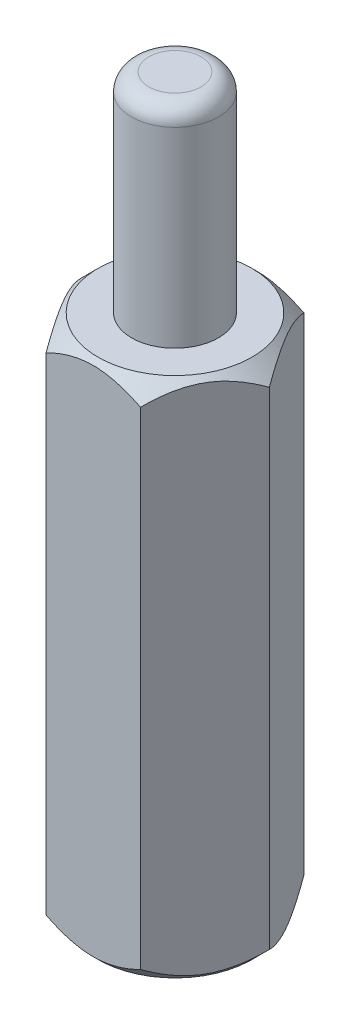
ISO-10303-21;
HEADER;
FILE_DESCRIPTION(('STEP AP214'),'2;1');
FILE_NAME('part.step','',(''),(''),'','','');
FILE_SCHEMA(('AUTOMOTIVE_DESIGN { 1 0 10303 214 1 1 1 1 }'));
ENDSEC;
DATA;
#1=APPLICATION_CONTEXT('core data for automotive mechanical design processes');
#2=APPLICATION_PROTOCOL_DEFINITION('international standard','automotive_design',2000,#1);
#3=PRODUCT_CONTEXT('',#1,'mechanical');
#4=PRODUCT('Part','Part','',(#3));
#5=PRODUCT_RELATED_PRODUCT_CATEGORY('part','',(#4));
#6=PRODUCT_DEFINITION_FORMATION('','',#4);
#7=PRODUCT_DEFINITION_CONTEXT('part definition',#1,'design');
#8=PRODUCT_DEFINITION('design','',#6,#7);
#9=PRODUCT_DEFINITION_SHAPE('','',#8);
#10=(LENGTH_UNIT() NAMED_UNIT(*) SI_UNIT(.MILLI.,.METRE.));
#11=(NAMED_UNIT(*) PLANE_ANGLE_UNIT() SI_UNIT($,.RADIAN.));
#12=(NAMED_UNIT(*) SI_UNIT($,.STERADIAN.) SOLID_ANGLE_UNIT());
#13=UNCERTAINTY_MEASURE_WITH_UNIT(LENGTH_MEASURE(1.E-05),#10,'distance_accuracy_value','');
#14=(GEOMETRIC_REPRESENTATION_CONTEXT(3) GLOBAL_UNCERTAINTY_ASSIGNED_CONTEXT((#13)) GLOBAL_UNIT_ASSIGNED_CONTEXT((#10,
#11,#12)) REPRESENTATION_CONTEXT('',''));
#15=CARTESIAN_POINT('',(0.,0.,0.));
#16=DIRECTION('',(0.,0.,1.));
#17=DIRECTION('',(1.,0.,0.));
#18=AXIS2_PLACEMENT_3D('',#15,#16,#17);
#19=CARTESIAN_POINT('',(0.,21.,0.));
#20=DIRECTION('',(0.,-1.,0.));
#21=DIRECTION('',(0.,0.,-1.));
#22=AXIS2_PLACEMENT_3D('',#19,#20,#21);
#23=CYLINDRICAL_SURFACE('',#22,1.25);
#24=CARTESIAN_POINT('',(0.,20.5,0.));
#25=DIRECTION('',(0.,1.,0.));
#26=DIRECTION('',(0.,0.,1.));
#27=AXIS2_PLACEMENT_3D('',#24,#25,#26);
#28=CIRCLE('',#27,1.25);
#29=CARTESIAN_POINT('',(0.,20.5,1.25));
#30=VERTEX_POINT('',#29);
#31=EDGE_CURVE('E11',#30,#30,#28,.F.);
#32=ORIENTED_EDGE('',*,*,#31,.T.);
#33=EDGE_LOOP('',(#32));
#34=FACE_BOUND('',#33,.T.);
#35=CARTESIAN_POINT('',(0.,15.,0.));
#36=DIRECTION('',(0.,1.,0.));
#37=DIRECTION('',(0.,0.,1.));
#38=AXIS2_PLACEMENT_3D('',#35,#36,#37);
#39=CIRCLE('',#38,1.25);
#40=CARTESIAN_POINT('',(0.,15.,1.25));
#41=VERTEX_POINT('',#40);
#42=EDGE_CURVE('E57',#41,#41,#39,.T.);
#43=ORIENTED_EDGE('',*,*,#42,.T.);
#44=EDGE_LOOP('',(#43));
#45=FACE_BOUND('',#44,.T.);
#46=ADVANCED_FACE('F46',(#34,#45),#23,.T.);
#47=CARTESIAN_POINT('',(0.,21.,0.));
#48=DIRECTION('',(0.,1.,0.));
#49=DIRECTION('',(0.,0.,1.));
#50=AXIS2_PLACEMENT_3D('',#47,#48,#49);
#51=PLANE('',#50);
#52=CARTESIAN_POINT('',(0.,21.,0.));
#53=DIRECTION('',(0.,1.,0.));
#54=DIRECTION('',(0.,0.,1.));
#55=AXIS2_PLACEMENT_3D('',#52,#53,#54);
#56=CIRCLE('',#55,0.75);
#57=CARTESIAN_POINT('',(0.,21.,0.75));
#58=VERTEX_POINT('',#57);
#59=EDGE_CURVE('E53',#58,#58,#56,.T.);
#60=ORIENTED_EDGE('',*,*,#59,.T.);
#61=EDGE_LOOP('',(#60));
#62=FACE_BOUND('',#61,.T.);
#63=ADVANCED_FACE('F67',(#62),#51,.T.);
#64=CARTESIAN_POINT('',(0.,15.,0.));
#65=DIRECTION('',(0.,1.,0.));
#66=DIRECTION('',(0.,0.,1.));
#67=AXIS2_PLACEMENT_3D('',#64,#65,#66);
#68=PLANE('',#67);
#69=ORIENTED_EDGE('',*,*,#42,.F.);
#70=EDGE_LOOP('',(#69));
#71=FACE_BOUND('',#70,.T.);
#72=ADVANCED_FACE('F65',(#71),#68,.F.);
#73=CARTESIAN_POINT('',(0.,20.5,0.));
#74=DIRECTION('',(0.,1.,0.));
#75=DIRECTION('',(0.,0.,1.));
#76=AXIS2_PLACEMENT_3D('',#73,#74,#75);
#77=TOROIDAL_SURFACE('',#76,0.75,0.5);
#78=ORIENTED_EDGE('',*,*,#31,.F.);
#79=EDGE_LOOP('',(#78));
#80=FACE_BOUND('',#79,.T.);
#81=ORIENTED_EDGE('',*,*,#59,.F.);
#82=EDGE_LOOP('',(#81));
#83=FACE_BOUND('',#82,.T.);
#84=ADVANCED_FACE('F48',(#80,#83),#77,.T.);
#85=CLOSED_SHELL('',(#46,#63,#72,#84));
#86=MANIFOLD_SOLID_BREP('B2',#85);
#87=CARTESIAN_POINT('',(1.35677313259565,15.,2.34999999999999));
#88=DIRECTION('',(-0.866025403784441,0.,-0.499999999999995));
#89=DIRECTION('',(-0.499999999999995,0.,0.866025403784441));
#90=AXIS2_PLACEMENT_3D('',#87,#88,#89);
#91=PLANE('',#90);
#92=CARTESIAN_POINT('',(2.71366173524508,0.500115477423954,-0.0002));
#93=CARTESIAN_POINT('',(2.66702181897453,0.45351442075486,0.0805827046413603));
#94=CARTESIAN_POINT('',(2.619602011949,0.409650231593763,0.162716219694685));
#95=CARTESIAN_POINT('',(2.5229077509184,0.329335803551845,0.33019559260002));
#96=CARTESIAN_POINT('',(2.47362410019065,0.292930253802988,0.415557379642964));
#97=CARTESIAN_POINT('',(2.37424596072594,0.230566757708878,0.5876853663575));
#98=CARTESIAN_POINT('',(2.3241767832868,0.204452056148391,0.674407725575282));
#99=CARTESIAN_POINT('',(2.22293612155872,0.164216868168014,0.84976169548021));
#100=CARTESIAN_POINT('',(2.17176773038475,0.150066345438941,0.938387948735085));
#101=CARTESIAN_POINT('',(2.08358239463315,0.137298959127493,1.09112943073937));
#102=CARTESIAN_POINT('',(2.04667938843036,0.13540889555121,1.15504731243464));
#103=CARTESIAN_POINT('',(1.97293369217404,0.138592545290332,1.28277860519013));
#104=CARTESIAN_POINT('',(1.93609102779937,0.143668700006084,1.34659197177326));
#105=CARTESIAN_POINT('',(1.86275357290835,0.160495922051712,1.47361616974231));
#106=CARTESIAN_POINT('',(1.82625921808281,0.172254456697005,1.53682624648959));
#107=CARTESIAN_POINT('',(1.75390158173959,0.201800980357546,1.66215334895163));
#108=CARTESIAN_POINT('',(1.71803825206632,0.219588507163032,1.72427045807434));
#109=CARTESIAN_POINT('',(1.62617552865636,0.272395503913702,1.88338136234204));
#110=CARTESIAN_POINT('',(1.57074576121927,0.311395733846912,1.97938853579481));
#111=CARTESIAN_POINT('',(1.48924118578274,0.377233579565033,2.12055860150021));
#112=CARTESIAN_POINT('',(1.46238179358799,0.400365987274775,2.16708043344193));
#113=CARTESIAN_POINT('',(1.40916054946841,0.44873951612495,2.25926233229908));
#114=CARTESIAN_POINT('',(1.38279840408548,0.47397934255917,2.30492290749882));
#115=CARTESIAN_POINT('',(1.35665766254181,0.500115477423954,2.35019999999999));
#116=B_SPLINE_CURVE_WITH_KNOTS('',3,(#92,#93,#94,#95,#96,#97,#98,#99,#100,#101,#102,#103,#104,
#105,#106,#107,#108,#109,#110,#111,#112,#113,#114,#115),.UNSPECIFIED.,.F.,.F.,(4,2,2,2,2,2,2,2,
2,2,2,4),(0.,0.313034643638936,0.627893288091257,0.937751034486846,1.24682854729337,
1.46800568908581,1.68926036503641,1.91076277253884,2.13224820250606,2.4840684999269,
2.65950165672958,2.83482781708433),.UNSPECIFIED.);
#117=CARTESIAN_POINT('',(2.71354626519124,0.5,0.));
#118=VERTEX_POINT('',#117);
#119=CARTESIAN_POINT('',(1.35677313259565,0.5,2.34999999999999));
#120=VERTEX_POINT('',#119);
#121=EDGE_CURVE('E116',#118,#120,#116,.T.);
#122=ORIENTED_EDGE('',*,*,#121,.F.);
#123=DIRECTION('',(0.,-1.,0.));
#124=VECTOR('',#123,1.);
#125=CARTESIAN_POINT('',(2.71354626519124,15.,0.));
#126=LINE('',#125,#124);
#127=CARTESIAN_POINT('',(2.71354626519124,14.5,0.));
#128=VERTEX_POINT('',#127);
#129=EDGE_CURVE('E44',#128,#118,#126,.T.);
#130=ORIENTED_EDGE('',*,*,#129,.F.);
#131=CARTESIAN_POINT('',(1.35665766254181,14.499884522576,2.35019999999999));
#132=CARTESIAN_POINT('',(1.40329757881237,14.5464855792451,2.26941729535863));
#133=CARTESIAN_POINT('',(1.45071738583789,14.5903497684062,2.1872837803053));
#134=CARTESIAN_POINT('',(1.5474116468685,14.6706641964482,2.01980440739997));
#135=CARTESIAN_POINT('',(1.59669529759625,14.707069746197,1.93444262035702));
#136=CARTESIAN_POINT('',(1.69607343706095,14.7694332422911,1.76231463364249));
#137=CARTESIAN_POINT('',(1.7461426145001,14.7955479438516,1.6755922744247));
#138=CARTESIAN_POINT('',(1.84738327622817,14.835783131832,1.50023830451978));
#139=CARTESIAN_POINT('',(1.89855166740214,14.8499336545611,1.4116120512649));
#140=CARTESIAN_POINT('',(1.98673700315374,14.8627010408725,1.25887056926061));
#141=CARTESIAN_POINT('',(2.02364000935653,14.8645911044488,1.19495268756535));
#142=CARTESIAN_POINT('',(2.09738570561285,14.8614074547097,1.06722139480986));
#143=CARTESIAN_POINT('',(2.13422836998752,14.8563312999939,1.00340802822673));
#144=CARTESIAN_POINT('',(2.20756582487855,14.8395040779483,0.876383830257676));
#145=CARTESIAN_POINT('',(2.24406017970408,14.827745543303,0.8131737535104));
#146=CARTESIAN_POINT('',(2.3164178160473,14.7981990196425,0.687846651048354));
#147=CARTESIAN_POINT('',(2.35228114572057,14.780411492837,0.625729541925647));
#148=CARTESIAN_POINT('',(2.44414386913054,14.7276044960863,0.466618637657944));
#149=CARTESIAN_POINT('',(2.49957363656762,14.6886042661531,0.370611464205181));
#150=CARTESIAN_POINT('',(2.58107821200415,14.622766420435,0.229441398499779));
#151=CARTESIAN_POINT('',(2.6079376041989,14.5996340127252,0.182919566558057));
#152=CARTESIAN_POINT('',(2.66115884831848,14.551260483875,0.0907376677009106));
#153=CARTESIAN_POINT('',(2.68752099370141,14.5260206574408,0.0450770925011708));
#154=CARTESIAN_POINT('',(2.71366173524508,14.499884522576,-0.000199999999999792));
#155=B_SPLINE_CURVE_WITH_KNOTS('',3,(#131,#132,#133,#134,#135,#136,#137,#138,#139,#140,#141,
#142,#143,#144,#145,#146,#147,#148,#149,#150,#151,#152,#153,#154),.UNSPECIFIED.,.F.,.F.,(4,2,2,
2,2,2,2,2,2,2,2,4),(0.,0.313034643638936,0.627893288091257,0.937751034486846,1.24682854729337,
1.46800568908581,1.68926036503641,1.91076277253884,2.13224820250606,2.4840684999269,
2.65950165672958,2.83482781708433),.UNSPECIFIED.);
#156=CARTESIAN_POINT('',(1.35677313259565,14.5,2.34999999999999));
#157=VERTEX_POINT('',#156);
#158=EDGE_CURVE('E188',#157,#128,#155,.T.);
#159=ORIENTED_EDGE('',*,*,#158,.F.);
#160=DIRECTION('',(0.,-1.,0.));
#161=VECTOR('',#160,1.);
#162=CARTESIAN_POINT('',(1.35677313259565,15.,2.34999999999999));
#163=LINE('',#162,#161);
#164=EDGE_CURVE('E181',#157,#120,#163,.T.);
#165=ORIENTED_EDGE('',*,*,#164,.T.);
#166=EDGE_LOOP('',(#122,#130,#159,#165));
#167=FACE_BOUND('',#166,.T.);
#168=ADVANCED_FACE('F101',(#167),#91,.F.);
#169=CARTESIAN_POINT('',(2.71354626519124,15.,0.));
#170=DIRECTION('',(-0.866025403784438,0.,0.500000000000001));
#171=DIRECTION('',(0.500000000000001,0.,0.866025403784438));
#172=AXIS2_PLACEMENT_3D('',#169,#170,#171);
#173=PLANE('',#172);
#174=CARTESIAN_POINT('',(1.35665766254178,0.500115477423953,-2.3502));
#175=CARTESIAN_POINT('',(1.40329757881233,0.453514420754859,-2.26941729535864));
#176=CARTESIAN_POINT('',(1.45071738583786,0.40965023159376,-2.18728378030532));
#177=CARTESIAN_POINT('',(1.54741164686847,0.329335803551841,-2.01980440739998));
#178=CARTESIAN_POINT('',(1.59669529759622,0.292930253802983,-1.93444262035704));
#179=CARTESIAN_POINT('',(1.69607343706092,0.230566757708871,-1.7623146336425));
#180=CARTESIAN_POINT('',(1.74614261450007,0.204452056148384,-1.67559227442472));
#181=CARTESIAN_POINT('',(1.84738327622815,0.164216868168006,-1.50023830451979));
#182=CARTESIAN_POINT('',(1.89855166740212,0.150066345438932,-1.41161205126491));
#183=CARTESIAN_POINT('',(1.98673700315372,0.137298959127484,-1.25887056926063));
#184=CARTESIAN_POINT('',(2.02364000935651,0.1354088955512,-1.19495268756536));
#185=CARTESIAN_POINT('',(2.09738570561283,0.138592545290322,-1.06722139480987));
#186=CARTESIAN_POINT('',(2.1342283699875,0.143668700006073,-1.00340802822674));
#187=CARTESIAN_POINT('',(2.20756582487853,0.160495922051701,-0.876383830257693));
#188=CARTESIAN_POINT('',(2.24406017970406,0.172254456696994,-0.813173753510418));
#189=CARTESIAN_POINT('',(2.31641781604728,0.201800980357535,-0.687846651048372));
#190=CARTESIAN_POINT('',(2.35228114572056,0.219588507163021,-0.625729541925665));
#191=CARTESIAN_POINT('',(2.44414386913052,0.272395503913691,-0.466618637657959));
#192=CARTESIAN_POINT('',(2.49957363656761,0.311395733846903,-0.370611464205192));
#193=CARTESIAN_POINT('',(2.58107821200415,0.377233579565027,-0.229441398499787));
#194=CARTESIAN_POINT('',(2.6079376041989,0.400365987274771,-0.182919566558063));
#195=CARTESIAN_POINT('',(2.66115884831848,0.448739516124948,-0.0907376677009135));
#196=CARTESIAN_POINT('',(2.68752099370141,0.473979342559168,-0.0450770925011722));
#197=CARTESIAN_POINT('',(2.71366173524508,0.500115477423954,0.000199999999999914));
#198=B_SPLINE_CURVE_WITH_KNOTS('',3,(#174,#175,#176,#177,#178,#179,#180,#181,#182,#183,#184,
#185,#186,#187,#188,#189,#190,#191,#192,#193,#194,#195,#196,#197),.UNSPECIFIED.,.F.,.F.,(4,2,2,
2,2,2,2,2,2,2,2,4),(0.,0.31303464363894,0.627893288091265,0.937751034486857,1.24682854729338,
1.46800568908582,1.68926036503642,1.91076277253885,2.13224820250607,2.48406849992692,
2.65950165672961,2.83482781708436),.UNSPECIFIED.);
#199=CARTESIAN_POINT('',(1.35677313259562,0.5,-2.35));
#200=VERTEX_POINT('',#199);
#201=EDGE_CURVE('E155',#200,#118,#198,.T.);
#202=ORIENTED_EDGE('',*,*,#201,.F.);
#203=DIRECTION('',(0.,-1.,0.));
#204=VECTOR('',#203,1.);
#205=CARTESIAN_POINT('',(1.35677313259562,15.,-2.35));
#206=LINE('',#205,#204);
#207=CARTESIAN_POINT('',(1.35677313259562,14.5,-2.35));
#208=VERTEX_POINT('',#207);
#209=EDGE_CURVE('E109',#208,#200,#206,.T.);
#210=ORIENTED_EDGE('',*,*,#209,.F.);
#211=CARTESIAN_POINT('',(2.71366173524508,14.499884522576,0.0002));
#212=CARTESIAN_POINT('',(2.66702181897452,14.5464855792451,-0.0805827046413609));
#213=CARTESIAN_POINT('',(2.619602011949,14.5903497684062,-0.162716219694686));
#214=CARTESIAN_POINT('',(2.52290775091839,14.6706641964482,-0.330195592600023));
#215=CARTESIAN_POINT('',(2.47362410019064,14.707069746197,-0.415557379642967));
#216=CARTESIAN_POINT('',(2.37424596072593,14.7694332422911,-0.587685366357504));
#217=CARTESIAN_POINT('',(2.32417678328679,14.7955479438516,-0.674407725575286));
#218=CARTESIAN_POINT('',(2.22293612155871,14.835783131832,-0.849761695480216));
#219=CARTESIAN_POINT('',(2.17176773038473,14.8499336545611,-0.938387948735092));
#220=CARTESIAN_POINT('',(2.08358239463314,14.8627010408725,-1.09112943073938));
#221=CARTESIAN_POINT('',(2.04667938843035,14.8645911044488,-1.15504731243464));
#222=CARTESIAN_POINT('',(1.97293369217402,14.8614074547097,-1.28277860519013));
#223=CARTESIAN_POINT('',(1.93609102779936,14.8563312999939,-1.34659197177326));
#224=CARTESIAN_POINT('',(1.86275357290833,14.8395040779483,-1.47361616974231));
#225=CARTESIAN_POINT('',(1.82625921808279,14.827745543303,-1.53682624648959));
#226=CARTESIAN_POINT('',(1.75390158173958,14.7981990196425,-1.66215334895164));
#227=CARTESIAN_POINT('',(1.7180382520663,14.780411492837,-1.72427045807434));
#228=CARTESIAN_POINT('',(1.62617552865633,14.7276044960863,-1.88338136234205));
#229=CARTESIAN_POINT('',(1.57074576121924,14.6886042661531,-1.97938853579481));
#230=CARTESIAN_POINT('',(1.48924118578271,14.622766420435,-2.12055860150022));
#231=CARTESIAN_POINT('',(1.46238179358796,14.5996340127252,-2.16708043344194));
#232=CARTESIAN_POINT('',(1.40916054946838,14.5512604838751,-2.25926233229909));
#233=CARTESIAN_POINT('',(1.38279840408545,14.5260206574408,-2.30492290749883));
#234=CARTESIAN_POINT('',(1.35665766254178,14.499884522576,-2.3502));
#235=B_SPLINE_CURVE_WITH_KNOTS('',3,(#211,#212,#213,#214,#215,#216,#217,#218,#219,#220,#221,
#222,#223,#224,#225,#226,#227,#228,#229,#230,#231,#232,#233,#234),.UNSPECIFIED.,.F.,.F.,(4,2,2,
2,2,2,2,2,2,2,2,4),(0.,0.31303464363894,0.627893288091266,0.937751034486858,1.24682854729339,
1.46800568908582,1.68926036503642,1.91076277253886,2.13224820250607,2.48406849992693,
2.65950165672961,2.83482781708436),.UNSPECIFIED.);
#236=EDGE_CURVE('E197',#128,#208,#235,.T.);
#237=ORIENTED_EDGE('',*,*,#236,.F.);
#238=ORIENTED_EDGE('',*,*,#129,.T.);
#239=EDGE_LOOP('',(#202,#210,#237,#238));
#240=FACE_BOUND('',#239,.T.);
#241=ADVANCED_FACE('F165',(#240),#173,.F.);
#242=CARTESIAN_POINT('',(1.35677313259562,15.,-2.35));
#243=DIRECTION('',(0.,0.,1.));
#244=DIRECTION('',(1.,0.,0.));
#245=AXIS2_PLACEMENT_3D('',#242,#243,#244);
#246=PLANE('',#245);
#247=CARTESIAN_POINT('',(-4.11620007747229,2.5262430843245,-2.34999999999999));
#248=CARTESIAN_POINT('',(-3.99456062407984,2.4206482959392,-2.34999999999999));
#249=CARTESIAN_POINT('',(-3.87238420139626,2.31565939195619,-2.34999999999999));
#250=CARTESIAN_POINT('',(-3.62654046205172,2.10732553559251,-2.34999999999999));
#251=CARTESIAN_POINT('',(-3.50287246949324,2.00398138180499,-2.34999999999999));
#252=CARTESIAN_POINT('',(-3.25092428246666,1.79715607348113,-2.34999999999999));
#253=CARTESIAN_POINT('',(-3.1226030423497,1.69372472451252,-2.34999999999999));
#254=CARTESIAN_POINT('',(-2.86355572230193,1.48997092714896,-2.34999999999999));
#255=CARTESIAN_POINT('',(-2.73283025157604,1.38964770802441,-2.34999999999999));
#256=CARTESIAN_POINT('',(-2.46800641513511,1.1931600446047,-2.34999999999999));
#257=CARTESIAN_POINT('',(-2.3339038896,1.09700117040959,-2.34999999999999));
#258=CARTESIAN_POINT('',(-2.0613032743926,0.910799147560652,-2.34999999999999));
#259=CARTESIAN_POINT('',(-1.92280172588298,0.820760995346968,-2.34999999999999));
#260=CARTESIAN_POINT('',(-1.64117355798615,0.650614047542826,-2.34999999999999));
#261=CARTESIAN_POINT('',(-1.49808943768717,0.570435820386812,-2.34999999999999));
#262=CARTESIAN_POINT('',(-1.20485643379896,0.424271739306382,-2.35));
#263=CARTESIAN_POINT('',(-1.05472107043102,0.35825997581425,-2.35));
#264=CARTESIAN_POINT('',(-0.821865462112486,0.274942485534353,-2.35));
#265=CARTESIAN_POINT('',(-0.742036508278311,0.249595685883113,-2.35));
#266=CARTESIAN_POINT('',(-0.580476501018406,0.205835788601103,-2.35));
#267=CARTESIAN_POINT('',(-0.498745753007967,0.187421585691351,-2.35));
#268=CARTESIAN_POINT('',(-0.334372246307214,0.15875365473776,-2.35));
#269=CARTESIAN_POINT('',(-0.251738546335381,0.148448964635506,-2.35));
#270=CARTESIAN_POINT('',(-0.0858407417653292,0.136566289649942,-2.35));
#271=CARTESIAN_POINT('',(-0.00257670926849857,0.134987321327513,-2.35));
#272=CARTESIAN_POINT('',(0.163777303536675,0.140683761884499,-2.35));
#273=CARTESIAN_POINT('',(0.246866776487838,0.147973655828653,-2.35));
#274=CARTESIAN_POINT('',(0.411882632160691,0.170874266382379,-2.35));
#275=CARTESIAN_POINT('',(0.493808778405906,0.186486650583509,-2.35));
#276=CARTESIAN_POINT('',(0.656483138387225,0.225136666290385,-2.35));
#277=CARTESIAN_POINT('',(0.737218600446381,0.24822702200939,-2.35));
#278=CARTESIAN_POINT('',(0.89663513591736,0.300570119750988,-2.35));
#279=CARTESIAN_POINT('',(0.975316175413214,0.329822963436416,-2.35));
#280=CARTESIAN_POINT('',(1.14744588710944,0.40020384861402,-2.35));
#281=CARTESIAN_POINT('',(1.24039977634964,0.44253155797546,-2.35));
#282=CARTESIAN_POINT('',(1.42354442733167,0.5328381943151,-2.35));
#283=CARTESIAN_POINT('',(1.51373356413394,0.580820367305655,-2.35));
#284=CARTESIAN_POINT('',(1.69185571070467,0.681182160709709,-2.35000000000001));
#285=CARTESIAN_POINT('',(1.77978369059033,0.733570635503712,-2.35000000000001));
#286=CARTESIAN_POINT('',(1.95354761418705,0.841649940673027,-2.35000000000001));
#287=CARTESIAN_POINT('',(2.03938396636662,0.897340118855266,-2.35000000000001));
#288=CARTESIAN_POINT('',(2.20977468778742,1.01160311087831,-2.35000000000001));
#289=CARTESIAN_POINT('',(2.29431973959119,1.07018975488298,-2.35000000000001));
#290=CARTESIAN_POINT('',(2.46194608751648,1.18942577021325,-2.35000000000001));
#291=CARTESIAN_POINT('',(2.54502727250729,1.25007529712891,-2.35000000000001));
#292=CARTESIAN_POINT('',(2.79224195212483,1.43432754969047,-2.35000000000001));
#293=CARTESIAN_POINT('',(2.95455149425201,1.56037440725253,-2.35000000000001));
#294=CARTESIAN_POINT('',(3.28611603645723,1.82508053476038,-2.35000000000001));
#295=CARTESIAN_POINT('',(3.45513899155155,1.96402766342604,-2.35000000000001));
#296=CARTESIAN_POINT('',(3.70562895012552,2.17418356155825,-2.35000000000001));
#297=CARTESIAN_POINT('',(3.78816309544242,2.24412720654322,-2.35000000000001));
#298=CARTESIAN_POINT('',(3.95261548683786,2.38469838643999,-2.35000000000001));
#299=CARTESIAN_POINT('',(4.03453386561131,2.45532576604052,-2.35000000000001));
#300=CARTESIAN_POINT('',(4.11620007747227,2.5262430843245,-2.35000000000001));
#301=B_SPLINE_CURVE_WITH_KNOTS('',3,(#247,#248,#249,#250,#251,#252,#253,#254,#255,#256,#257,
#258,#259,#260,#261,#262,#263,#264,#265,#266,#267,#268,#269,#270,#271,#272,#273,#274,#275,#276,
#277,#278,#279,#280,#281,#282,#283,#284,#285,#286,#287,#288,#289,#290,#291,#292,#293,#294,#295,
#296,#297,#298,#299,#300),.UNSPECIFIED.,.F.,.F.,(4,2,2,2,2,2,2,2,2,2,2,2,2,2,2,2,2,2,2,2,2,2,2,
2,2,2,4),(0.,0.483247159798947,0.96672220657701,1.46113633492303,1.95542686476531,
2.45035931762353,2.94569105676271,3.43730630445939,3.92801460806787,4.17903396485375,
4.43001328411246,4.67940250839623,4.92876362450418,5.17853255685014,5.42835155464483,
5.67997173963929,5.93159607594807,6.2377494192109,6.5440793775366,6.85104032130647,
7.15794083110096,7.46648353445715,7.77504956104604,8.39143691317243,9.04779093244822,
9.37234292136603,9.6968228413157),.UNSPECIFIED.);
#302=CARTESIAN_POINT('',(-1.35677313259563,0.5,-2.35));
#303=VERTEX_POINT('',#302);
#304=EDGE_CURVE('E152',#303,#200,#301,.T.);
#305=ORIENTED_EDGE('',*,*,#304,.F.);
#306=DIRECTION('',(0.,-1.,0.));
#307=VECTOR('',#306,1.);
#308=CARTESIAN_POINT('',(-1.35677313259563,15.,-2.35));
#309=LINE('',#308,#307);
#310=CARTESIAN_POINT('',(-1.35677313259563,14.5,-2.35));
#311=VERTEX_POINT('',#310);
#312=EDGE_CURVE('E172',#311,#303,#309,.T.);
#313=ORIENTED_EDGE('',*,*,#312,.F.);
#314=CARTESIAN_POINT('',(4.11620007747227,12.4737569156755,-2.35000000000001));
#315=CARTESIAN_POINT('',(3.99456062407982,12.5793517040608,-2.35000000000001));
#316=CARTESIAN_POINT('',(3.87238420139625,12.6843406080438,-2.35000000000001));
#317=CARTESIAN_POINT('',(3.62654046205171,12.8926744644075,-2.35000000000001));
#318=CARTESIAN_POINT('',(3.50287246949323,12.996018618195,-2.35000000000001));
#319=CARTESIAN_POINT('',(3.25092428246665,13.2028439265189,-2.35000000000001));
#320=CARTESIAN_POINT('',(3.12260304234969,13.3062752754875,-2.35000000000001));
#321=CARTESIAN_POINT('',(2.86355572230191,13.510029072851,-2.35000000000001));
#322=CARTESIAN_POINT('',(2.73283025157602,13.6103522919756,-2.35000000000001));
#323=CARTESIAN_POINT('',(2.4680064151351,13.8068399553953,-2.35000000000001));
#324=CARTESIAN_POINT('',(2.33390388959999,13.9029988295904,-2.35000000000001));
#325=CARTESIAN_POINT('',(2.06130327439258,14.0892008524393,-2.35000000000001));
#326=CARTESIAN_POINT('',(1.92280172588297,14.179239004653,-2.35000000000001));
#327=CARTESIAN_POINT('',(1.64117355798613,14.3493859524572,-2.35000000000001));
#328=CARTESIAN_POINT('',(1.49808943768716,14.4295641796132,-2.35));
#329=CARTESIAN_POINT('',(1.20485643379894,14.5757282606936,-2.35));
#330=CARTESIAN_POINT('',(1.054721070431,14.6417400241858,-2.35));
#331=CARTESIAN_POINT('',(0.821865462112469,14.7250575144656,-2.35));
#332=CARTESIAN_POINT('',(0.742036508278294,14.7504043141169,-2.35));
#333=CARTESIAN_POINT('',(0.580476501018389,14.7941642113989,-2.35));
#334=CARTESIAN_POINT('',(0.498745753007949,14.8125784143086,-2.35));
#335=CARTESIAN_POINT('',(0.334372246307196,14.8412463452622,-2.35));
#336=CARTESIAN_POINT('',(0.251738546335363,14.8515510353645,-2.35));
#337=CARTESIAN_POINT('',(0.0858407417653119,14.8634337103501,-2.35));
#338=CARTESIAN_POINT('',(0.00257670926848113,14.8650126786725,-2.35));
#339=CARTESIAN_POINT('',(-0.163777303536693,14.8593162381155,-2.35));
#340=CARTESIAN_POINT('',(-0.246866776487856,14.8520263441713,-2.35));
#341=CARTESIAN_POINT('',(-0.411882632160708,14.8291257336176,-2.35));
#342=CARTESIAN_POINT('',(-0.493808778405924,14.8135133494165,-2.35));
#343=CARTESIAN_POINT('',(-0.656483138387243,14.7748633337096,-2.35));
#344=CARTESIAN_POINT('',(-0.737218600446399,14.7517729779906,-2.35));
#345=CARTESIAN_POINT('',(-0.896635135917378,14.699429880249,-2.35));
#346=CARTESIAN_POINT('',(-0.975316175413232,14.6701770365636,-2.35));
#347=CARTESIAN_POINT('',(-1.14744588710946,14.599796151386,-2.35));
#348=CARTESIAN_POINT('',(-1.24039977634965,14.5574684420245,-2.35));
#349=CARTESIAN_POINT('',(-1.42354442733168,14.4671618056849,-2.34999999999999));
#350=CARTESIAN_POINT('',(-1.51373356413396,14.4191796326943,-2.34999999999999));
#351=CARTESIAN_POINT('',(-1.69185571070469,14.3188178392903,-2.34999999999999));
#352=CARTESIAN_POINT('',(-1.77978369059035,14.2664293644963,-2.34999999999999));
#353=CARTESIAN_POINT('',(-1.95354761418706,14.158350059327,-2.34999999999999));
#354=CARTESIAN_POINT('',(-2.03938396636664,14.1026598811447,-2.34999999999999));
#355=CARTESIAN_POINT('',(-2.20977468778744,13.9883968891217,-2.34999999999999));
#356=CARTESIAN_POINT('',(-2.29431973959121,13.929810245117,-2.34999999999999));
#357=CARTESIAN_POINT('',(-2.4619460875165,13.8105742297867,-2.34999999999999));
#358=CARTESIAN_POINT('',(-2.54502727250731,13.7499247028711,-2.34999999999999));
#359=CARTESIAN_POINT('',(-2.79224195212485,13.5656724503095,-2.34999999999999));
#360=CARTESIAN_POINT('',(-2.95455149425204,13.4396255927475,-2.34999999999999));
#361=CARTESIAN_POINT('',(-3.28611603645725,13.1749194652396,-2.34999999999999));
#362=CARTESIAN_POINT('',(-3.45513899155157,13.035972336574,-2.34999999999999));
#363=CARTESIAN_POINT('',(-3.70562895012554,12.8258164384417,-2.34999999999999));
#364=CARTESIAN_POINT('',(-3.78816309544244,12.7558727934568,-2.34999999999999));
#365=CARTESIAN_POINT('',(-3.95261548683787,12.61530161356,-2.34999999999999));
#366=CARTESIAN_POINT('',(-4.03453386561132,12.5446742339595,-2.34999999999999));
#367=CARTESIAN_POINT('',(-4.11620007747229,12.4737569156755,-2.34999999999999));
#368=B_SPLINE_CURVE_WITH_KNOTS('',3,(#314,#315,#316,#317,#318,#319,#320,#321,#322,#323,#324,
#325,#326,#327,#328,#329,#330,#331,#332,#333,#334,#335,#336,#337,#338,#339,#340,#341,#342,#343,
#344,#345,#346,#347,#348,#349,#350,#351,#352,#353,#354,#355,#356,#357,#358,#359,#360,#361,#362,
#363,#364,#365,#366,#367),.UNSPECIFIED.,.F.,.F.,(4,2,2,2,2,2,2,2,2,2,2,2,2,2,2,2,2,2,2,2,2,2,2,
2,2,2,4),(0.,0.483247159798947,0.966722206577009,1.46113633492302,1.95542686476531,
2.45035931762353,2.94569105676271,3.43730630445939,3.92801460806787,4.17903396485375,
4.43001328411246,4.67940250839623,4.92876362450418,5.17853255685014,5.42835155464483,
5.67997173963929,5.93159607594807,6.2377494192109,6.5440793775366,6.85104032130648,
7.15794083110096,7.46648353445716,7.77504956104604,8.39143691317244,9.04779093244823,
9.37234292136603,9.6968228413157),.UNSPECIFIED.);
#369=EDGE_CURVE('E171',#208,#311,#368,.T.);
#370=ORIENTED_EDGE('',*,*,#369,.F.);
#371=ORIENTED_EDGE('',*,*,#209,.T.);
#372=EDGE_LOOP('',(#305,#313,#370,#371));
#373=FACE_BOUND('',#372,.T.);
#374=ADVANCED_FACE('F170',(#373),#246,.F.);
#375=CARTESIAN_POINT('',(-1.35677313259563,15.,-2.35));
#376=DIRECTION('',(0.866025403784441,0.,0.499999999999995));
#377=DIRECTION('',(0.499999999999995,0.,-0.866025403784442));
#378=AXIS2_PLACEMENT_3D('',#375,#376,#377);
#379=PLANE('',#378);
#380=CARTESIAN_POINT('',(-2.71366173524508,0.500115477423954,0.000200000000018949));
#381=CARTESIAN_POINT('',(-2.66702181897453,0.45351442075486,-0.0805827046413419));
#382=CARTESIAN_POINT('',(-2.619602011949,0.409650231593761,-0.162716219694667));
#383=CARTESIAN_POINT('',(-2.52290775091839,0.329335803551842,-0.330195592600005));
#384=CARTESIAN_POINT('',(-2.47362410019064,0.292930253802983,-0.41555737964295));
#385=CARTESIAN_POINT('',(-2.37424596072594,0.230566757708871,-0.587685366357488));
#386=CARTESIAN_POINT('',(-2.32417678328679,0.204452056148384,-0.67440772557527));
#387=CARTESIAN_POINT('',(-2.22293612155871,0.164216868168006,-0.849761695480201));
#388=CARTESIAN_POINT('',(-2.17176773038474,0.150066345438931,-0.938387948735077));
#389=CARTESIAN_POINT('',(-2.08358239463315,0.137298959127484,-1.09112943073936));
#390=CARTESIAN_POINT('',(-2.04667938843035,0.1354088955512,-1.15504731243463));
#391=CARTESIAN_POINT('',(-1.97293369217403,0.138592545290323,-1.28277860519012));
#392=CARTESIAN_POINT('',(-1.93609102779937,0.143668700006074,-1.34659197177325));
#393=CARTESIAN_POINT('',(-1.86275357290834,0.160495922051702,-1.4736161697423));
#394=CARTESIAN_POINT('',(-1.8262592180828,0.172254456696994,-1.53682624648958));
#395=CARTESIAN_POINT('',(-1.75390158173959,0.201800980357535,-1.66215334895162));
#396=CARTESIAN_POINT('',(-1.71803825206631,0.219588507163022,-1.72427045807433));
#397=CARTESIAN_POINT('',(-1.62617552865635,0.272395503913692,-1.88338136234204));
#398=CARTESIAN_POINT('',(-1.57074576121926,0.311395733846904,-1.9793885357948));
#399=CARTESIAN_POINT('',(-1.48924118578273,0.377233579565028,-2.12055860150021));
#400=CARTESIAN_POINT('',(-1.46238179358798,0.400365987274771,-2.16708043344193));
#401=CARTESIAN_POINT('',(-1.40916054946839,0.448739516124948,-2.25926233229908));
#402=CARTESIAN_POINT('',(-1.38279840408547,0.473979342559168,-2.30492290749882));
#403=CARTESIAN_POINT('',(-1.35665766254179,0.500115477423954,-2.3502));
#404=B_SPLINE_CURVE_WITH_KNOTS('',3,(#380,#381,#382,#383,#384,#385,#386,#387,#388,#389,#390,
#391,#392,#393,#394,#395,#396,#397,#398,#399,#400,#401,#402,#403),.UNSPECIFIED.,.F.,.F.,(4,2,2,
2,2,2,2,2,2,2,2,4),(0.,0.31303464363894,0.627893288091266,0.937751034486858,1.24682854729339,
1.46800568908582,1.68926036503642,1.91076277253886,2.13224820250607,2.48406849992693,
2.65950165672961,2.83482781708436),.UNSPECIFIED.);
#405=CARTESIAN_POINT('',(-2.71354626519124,0.5,0.));
#406=VERTEX_POINT('',#405);
#407=EDGE_CURVE('E157',#406,#303,#404,.T.);
#408=ORIENTED_EDGE('',*,*,#407,.F.);
#409=DIRECTION('',(0.,-1.,0.));
#410=VECTOR('',#409,1.);
#411=CARTESIAN_POINT('',(-2.71354626519124,15.,0.));
#412=LINE('',#411,#410);
#413=CARTESIAN_POINT('',(-2.71354626519124,14.5,0.));
#414=VERTEX_POINT('',#413);
#415=EDGE_CURVE('E173',#414,#406,#412,.T.);
#416=ORIENTED_EDGE('',*,*,#415,.F.);
#417=CARTESIAN_POINT('',(-1.35665766254179,14.499884522576,-2.3502));
#418=CARTESIAN_POINT('',(-1.40329757881235,14.5464855792451,-2.26941729535863));
#419=CARTESIAN_POINT('',(-1.45071738583788,14.5903497684062,-2.18728378030531));
#420=CARTESIAN_POINT('',(-1.54741164686848,14.6706641964482,-2.01980440739997));
#421=CARTESIAN_POINT('',(-1.59669529759623,14.707069746197,-1.93444262035703));
#422=CARTESIAN_POINT('',(-1.69607343706094,14.7694332422911,-1.76231463364249));
#423=CARTESIAN_POINT('',(-1.74614261450008,14.7955479438516,-1.67559227442471));
#424=CARTESIAN_POINT('',(-1.84738327622816,14.835783131832,-1.50023830451978));
#425=CARTESIAN_POINT('',(-1.89855166740213,14.8499336545611,-1.4116120512649));
#426=CARTESIAN_POINT('',(-1.98673700315373,14.8627010408725,-1.25887056926061));
#427=CARTESIAN_POINT('',(-2.02364000935652,14.8645911044488,-1.19495268756535));
#428=CARTESIAN_POINT('',(-2.09738570561284,14.8614074547097,-1.06722139480986));
#429=CARTESIAN_POINT('',(-2.13422836998751,14.8563312999939,-1.00340802822673));
#430=CARTESIAN_POINT('',(-2.20756582487853,14.8395040779483,-0.876383830257676));
#431=CARTESIAN_POINT('',(-2.24406017970407,14.827745543303,-0.813173753510401));
#432=CARTESIAN_POINT('',(-2.31641781604729,14.7981990196425,-0.687846651048355));
#433=CARTESIAN_POINT('',(-2.35228114572056,14.780411492837,-0.625729541925648));
#434=CARTESIAN_POINT('',(-2.44414386913053,14.7276044960863,-0.466618637657942));
#435=CARTESIAN_POINT('',(-2.49957363656762,14.6886042661531,-0.370611464205175));
#436=CARTESIAN_POINT('',(-2.58107821200415,14.622766420435,-0.229441398499768));
#437=CARTESIAN_POINT('',(-2.6079376041989,14.5996340127252,-0.182919566558045));
#438=CARTESIAN_POINT('',(-2.66115884831848,14.5512604838751,-0.0907376677008949));
#439=CARTESIAN_POINT('',(-2.68752099370141,14.5260206574408,-0.0450770925011535));
#440=CARTESIAN_POINT('',(-2.71366173524508,14.499884522576,0.000200000000018677));
#441=B_SPLINE_CURVE_WITH_KNOTS('',3,(#417,#418,#419,#420,#421,#422,#423,#424,#425,#426,#427,
#428,#429,#430,#431,#432,#433,#434,#435,#436,#437,#438,#439,#440),.UNSPECIFIED.,.F.,.F.,(4,2,2,
2,2,2,2,2,2,2,2,4),(0.,0.31303464363894,0.627893288091266,0.937751034486857,1.24682854729339,
1.46800568908582,1.68926036503642,1.91076277253885,2.13224820250607,2.48406849992692,
2.65950165672961,2.83482781708436),.UNSPECIFIED.);
#442=EDGE_CURVE('E234',#311,#414,#441,.T.);
#443=ORIENTED_EDGE('',*,*,#442,.F.);
#444=ORIENTED_EDGE('',*,*,#312,.T.);
#445=EDGE_LOOP('',(#408,#416,#443,#444));
#446=FACE_BOUND('',#445,.T.);
#447=ADVANCED_FACE('F247',(#446),#379,.F.);
#448=CARTESIAN_POINT('',(-2.71354626519124,15.,0.));
#449=DIRECTION('',(0.866025403784434,0.,-0.500000000000007));
#450=DIRECTION('',(-0.500000000000007,0.,-0.866025403784435));
#451=AXIS2_PLACEMENT_3D('',#448,#449,#450);
#452=PLANE('',#451);
#453=CARTESIAN_POINT('',(-1.35665766254176,0.500115477423953,2.35020000000001));
#454=CARTESIAN_POINT('',(-1.40329757881232,0.453514420754859,2.26941729535865));
#455=CARTESIAN_POINT('',(-1.45071738583785,0.40965023159376,2.18728378030533));
#456=CARTESIAN_POINT('',(-1.54741164686845,0.329335803551841,2.01980440739999));
#457=CARTESIAN_POINT('',(-1.59669529759621,0.292930253802983,1.93444262035705));
#458=CARTESIAN_POINT('',(-1.69607343706091,0.230566757708871,1.76231463364251));
#459=CARTESIAN_POINT('',(-1.74614261450006,0.204452056148384,1.67559227442473));
#460=CARTESIAN_POINT('',(-1.84738327622814,0.164216868168006,1.5002383045198));
#461=CARTESIAN_POINT('',(-1.89855166740211,0.150066345438931,1.41161205126493));
#462=CARTESIAN_POINT('',(-1.98673700315371,0.137298959127484,1.25887056926064));
#463=CARTESIAN_POINT('',(-2.0236400093565,0.1354088955512,1.19495268756538));
#464=CARTESIAN_POINT('',(-2.09738570561283,0.138592545290322,1.06722139480989));
#465=CARTESIAN_POINT('',(-2.13422836998749,0.143668700006073,1.00340802822676));
#466=CARTESIAN_POINT('',(-2.20756582487852,0.160495922051702,0.876383830257706));
#467=CARTESIAN_POINT('',(-2.24406017970406,0.172254456696994,0.813173753510432));
#468=CARTESIAN_POINT('',(-2.31641781604728,0.201800980357535,0.687846651048386));
#469=CARTESIAN_POINT('',(-2.35228114572055,0.219588507163021,0.62572954192568));
#470=CARTESIAN_POINT('',(-2.44414386913052,0.272395503913692,0.466618637657975));
#471=CARTESIAN_POINT('',(-2.49957363656761,0.311395733846904,0.370611464205209));
#472=CARTESIAN_POINT('',(-2.58107821200415,0.377233579565028,0.229441398499804));
#473=CARTESIAN_POINT('',(-2.60793760419889,0.400365987274771,0.182919566558081));
#474=CARTESIAN_POINT('',(-2.66115884831848,0.448739516124948,0.0907376677009316));
#475=CARTESIAN_POINT('',(-2.68752099370141,0.473979342559168,0.0450770925011907));
#476=CARTESIAN_POINT('',(-2.71366173524508,0.500115477423954,-0.000199999999981032));
#477=B_SPLINE_CURVE_WITH_KNOTS('',3,(#453,#454,#455,#456,#457,#458,#459,#460,#461,#462,#463,
#464,#465,#466,#467,#468,#469,#470,#471,#472,#473,#474,#475,#476),.UNSPECIFIED.,.F.,.F.,(4,2,2,
2,2,2,2,2,2,2,2,4),(0.,0.31303464363894,0.627893288091265,0.937751034486857,1.24682854729339,
1.46800568908582,1.68926036503642,1.91076277253886,2.13224820250607,2.48406849992692,
2.65950165672961,2.83482781708436),.UNSPECIFIED.);
#478=CARTESIAN_POINT('',(-1.3567731325956,0.5,2.35000000000001));
#479=VERTEX_POINT('',#478);
#480=EDGE_CURVE('E281',#479,#406,#477,.T.);
#481=ORIENTED_EDGE('',*,*,#480,.F.);
#482=DIRECTION('',(0.,-1.,0.));
#483=VECTOR('',#482,1.);
#484=CARTESIAN_POINT('',(-1.3567731325956,15.,2.35000000000001));
#485=LINE('',#484,#483);
#486=CARTESIAN_POINT('',(-1.3567731325956,14.5,2.35000000000001));
#487=VERTEX_POINT('',#486);
#488=EDGE_CURVE('E178',#487,#479,#485,.T.);
#489=ORIENTED_EDGE('',*,*,#488,.F.);
#490=CARTESIAN_POINT('',(-2.71366173524508,14.499884522576,-0.000199999999981051));
#491=CARTESIAN_POINT('',(-2.66702181897452,14.5464855792451,0.0805827046413794));
#492=CARTESIAN_POINT('',(-2.619602011949,14.5903497684062,0.162716219694704));
#493=CARTESIAN_POINT('',(-2.52290775091839,14.6706641964482,0.330195592600041));
#494=CARTESIAN_POINT('',(-2.47362410019064,14.707069746197,0.415557379642985));
#495=CARTESIAN_POINT('',(-2.37424596072593,14.7694332422911,0.587685366357521));
#496=CARTESIAN_POINT('',(-2.32417678328678,14.7955479438516,0.674407725575303));
#497=CARTESIAN_POINT('',(-2.2229361215587,14.835783131832,0.849761695480232));
#498=CARTESIAN_POINT('',(-2.17176773038473,14.8499336545611,0.938387948735107));
#499=CARTESIAN_POINT('',(-2.08358239463313,14.8627010408725,1.09112943073939));
#500=CARTESIAN_POINT('',(-2.04667938843034,14.8645911044488,1.15504731243466));
#501=CARTESIAN_POINT('',(-1.97293369217402,14.8614074547097,1.28277860519015));
#502=CARTESIAN_POINT('',(-1.93609102779935,14.8563312999939,1.34659197177328));
#503=CARTESIAN_POINT('',(-1.86275357290832,14.8395040779483,1.47361616974233));
#504=CARTESIAN_POINT('',(-1.82625921808278,14.827745543303,1.5368262464896));
#505=CARTESIAN_POINT('',(-1.75390158173956,14.7981990196425,1.66215334895165));
#506=CARTESIAN_POINT('',(-1.71803825206629,14.780411492837,1.72427045807435));
#507=CARTESIAN_POINT('',(-1.62617552865632,14.7276044960863,1.88338136234206));
#508=CARTESIAN_POINT('',(-1.57074576121923,14.6886042661531,1.97938853579483));
#509=CARTESIAN_POINT('',(-1.4892411857827,14.622766420435,2.12055860150023));
#510=CARTESIAN_POINT('',(-1.46238179358795,14.5996340127252,2.16708043344195));
#511=CARTESIAN_POINT('',(-1.40916054946836,14.5512604838751,2.2592623322991));
#512=CARTESIAN_POINT('',(-1.38279840408544,14.5260206574408,2.30492290749884));
#513=CARTESIAN_POINT('',(-1.35665766254176,14.499884522576,2.35020000000001));
#514=B_SPLINE_CURVE_WITH_KNOTS('',3,(#490,#491,#492,#493,#494,#495,#496,#497,#498,#499,#500,
#501,#502,#503,#504,#505,#506,#507,#508,#509,#510,#511,#512,#513),.UNSPECIFIED.,.F.,.F.,(4,2,2,
2,2,2,2,2,2,2,2,4),(0.,0.31303464363894,0.627893288091266,0.937751034486858,1.24682854729339,
1.46800568908582,1.68926036503642,1.91076277253886,2.13224820250607,2.48406849992693,
2.65950165672961,2.83482781708436),.UNSPECIFIED.);
#515=EDGE_CURVE('E124',#414,#487,#514,.T.);
#516=ORIENTED_EDGE('',*,*,#515,.F.);
#517=ORIENTED_EDGE('',*,*,#415,.T.);
#518=EDGE_LOOP('',(#481,#489,#516,#517));
#519=FACE_BOUND('',#518,.T.);
#520=ADVANCED_FACE('F280',(#519),#452,.F.);
#521=CARTESIAN_POINT('',(-1.3567731325956,15.,2.35000000000001));
#522=DIRECTION('',(0.,0.,-1.));
#523=DIRECTION('',(-1.,0.,0.));
#524=AXIS2_PLACEMENT_3D('',#521,#522,#523);
#525=PLANE('',#524);
#526=CARTESIAN_POINT('',(4.11620007747231,2.5262430843245,2.34999999999996));
#527=CARTESIAN_POINT('',(3.99456062407985,2.4206482959392,2.34999999999996));
#528=CARTESIAN_POINT('',(3.87238420139628,2.31565939195619,2.34999999999996));
#529=CARTESIAN_POINT('',(3.62654046205174,2.10732553559251,2.34999999999996));
#530=CARTESIAN_POINT('',(3.50287246949326,2.00398138180499,2.34999999999996));
#531=CARTESIAN_POINT('',(3.25092428246668,1.79715607348114,2.34999999999997));
#532=CARTESIAN_POINT('',(3.12260304234972,1.69372472451252,2.34999999999997));
#533=CARTESIAN_POINT('',(2.86355572230194,1.48997092714896,2.34999999999997));
#534=CARTESIAN_POINT('',(2.73283025157605,1.38964770802441,2.34999999999997));
#535=CARTESIAN_POINT('',(2.46800641513513,1.19316004460471,2.34999999999997));
#536=CARTESIAN_POINT('',(2.33390388960002,1.09700117040959,2.34999999999998));
#537=CARTESIAN_POINT('',(2.06130327439261,0.910799147560652,2.34999999999998));
#538=CARTESIAN_POINT('',(1.922801725883,0.820760995346968,2.34999999999998));
#539=CARTESIAN_POINT('',(1.64117355798617,0.650614047542826,2.34999999999998));
#540=CARTESIAN_POINT('',(1.49808943768719,0.570435820386813,2.34999999999998));
#541=CARTESIAN_POINT('',(1.20485643379898,0.424271739306382,2.34999999999999));
#542=CARTESIAN_POINT('',(1.05472107043104,0.35825997581425,2.34999999999999));
#543=CARTESIAN_POINT('',(0.821865462112504,0.274942485534353,2.34999999999999));
#544=CARTESIAN_POINT('',(0.742036508278329,0.249595685883114,2.34999999999999));
#545=CARTESIAN_POINT('',(0.580476501018424,0.205835788601103,2.34999999999999));
#546=CARTESIAN_POINT('',(0.498745753007984,0.187421585691351,2.34999999999999));
#547=CARTESIAN_POINT('',(0.334372246307231,0.15875365473776,2.35));
#548=CARTESIAN_POINT('',(0.251738546335398,0.148448964635506,2.35));
#549=CARTESIAN_POINT('',(0.0858407417653466,0.136566289649942,2.35));
#550=CARTESIAN_POINT('',(0.00257670926851595,0.134987321327513,2.35));
#551=CARTESIAN_POINT('',(-0.163777303536658,0.140683761884498,2.35));
#552=CARTESIAN_POINT('',(-0.246866776487821,0.147973655828653,2.35));
#553=CARTESIAN_POINT('',(-0.411882632160673,0.170874266382379,2.35));
#554=CARTESIAN_POINT('',(-0.493808778405888,0.186486650583509,2.35));
#555=CARTESIAN_POINT('',(-0.656483138387208,0.225136666290385,2.35000000000001));
#556=CARTESIAN_POINT('',(-0.737218600446364,0.248227022009389,2.35000000000001));
#557=CARTESIAN_POINT('',(-0.896635135917343,0.300570119750988,2.35000000000001));
#558=CARTESIAN_POINT('',(-0.975316175413197,0.329822963436416,2.35000000000001));
#559=CARTESIAN_POINT('',(-1.14744588710943,0.40020384861402,2.35000000000001));
#560=CARTESIAN_POINT('',(-1.24039977634962,0.442531557975459,2.35000000000001));
#561=CARTESIAN_POINT('',(-1.42354442733165,0.532838194315099,2.35000000000001));
#562=CARTESIAN_POINT('',(-1.51373356413393,0.580820367305654,2.35000000000002));
#563=CARTESIAN_POINT('',(-1.69185571070465,0.681182160709708,2.35000000000002));
#564=CARTESIAN_POINT('',(-1.77978369059032,0.733570635503711,2.35000000000002));
#565=CARTESIAN_POINT('',(-1.95354761418703,0.841649940673027,2.35000000000002));
#566=CARTESIAN_POINT('',(-2.0393839663666,0.897340118855266,2.35000000000002));
#567=CARTESIAN_POINT('',(-2.20977468778741,1.01160311087831,2.35000000000002));
#568=CARTESIAN_POINT('',(-2.29431973959117,1.07018975488298,2.35000000000002));
#569=CARTESIAN_POINT('',(-2.46194608751646,1.18942577021325,2.35000000000003));
#570=CARTESIAN_POINT('',(-2.54502727250727,1.25007529712891,2.35000000000003));
#571=CARTESIAN_POINT('',(-2.79224195212481,1.43432754969047,2.35000000000003));
#572=CARTESIAN_POINT('',(-2.954551494252,1.56037440725252,2.35000000000003));
#573=CARTESIAN_POINT('',(-3.28611603645721,1.82508053476038,2.35000000000003));
#574=CARTESIAN_POINT('',(-3.45513899155153,1.96402766342604,2.35000000000004));
#575=CARTESIAN_POINT('',(-3.70562895012551,2.17418356155825,2.35000000000004));
#576=CARTESIAN_POINT('',(-3.7881630954424,2.24412720654322,2.35000000000004));
#577=CARTESIAN_POINT('',(-3.95261548683784,2.38469838643999,2.35000000000004));
#578=CARTESIAN_POINT('',(-4.03453386561129,2.45532576604053,2.35000000000004));
#579=CARTESIAN_POINT('',(-4.11620007747226,2.5262430843245,2.35000000000004));
#580=B_SPLINE_CURVE_WITH_KNOTS('',3,(#526,#527,#528,#529,#530,#531,#532,#533,#534,#535,#536,
#537,#538,#539,#540,#541,#542,#543,#544,#545,#546,#547,#548,#549,#550,#551,#552,#553,#554,#555,
#556,#557,#558,#559,#560,#561,#562,#563,#564,#565,#566,#567,#568,#569,#570,#571,#572,#573,#574,
#575,#576,#577,#578,#579),.UNSPECIFIED.,.F.,.F.,(4,2,2,2,2,2,2,2,2,2,2,2,2,2,2,2,2,2,2,2,2,2,2,
2,2,2,4),(0.,0.483247159798947,0.966722206577009,1.46113633492303,1.95542686476531,
2.45035931762353,2.94569105676271,3.43730630445939,3.92801460806787,4.17903396485375,
4.43001328411246,4.67940250839622,4.92876362450418,5.17853255685014,5.42835155464483,
5.67997173963929,5.93159607594806,6.23774941921089,6.5440793775366,6.85104032130647,
7.15794083110096,7.46648353445715,7.77504956104603,8.39143691317243,9.04779093244822,
9.37234292136603,9.6968228413157),.UNSPECIFIED.);
#581=EDGE_CURVE('E282',#120,#479,#580,.T.);
#582=ORIENTED_EDGE('',*,*,#581,.F.);
#583=ORIENTED_EDGE('',*,*,#164,.F.);
#584=CARTESIAN_POINT('',(-4.11620007747226,12.4737569156755,2.35000000000004));
#585=CARTESIAN_POINT('',(-3.9945606240798,12.5793517040608,2.35000000000004));
#586=CARTESIAN_POINT('',(-3.87238420139623,12.6843406080438,2.35000000000004));
#587=CARTESIAN_POINT('',(-3.62654046205169,12.8926744644075,2.35000000000004));
#588=CARTESIAN_POINT('',(-3.50287246949321,12.996018618195,2.35000000000004));
#589=CARTESIAN_POINT('',(-3.25092428246663,13.2028439265189,2.35000000000003));
#590=CARTESIAN_POINT('',(-3.12260304234967,13.3062752754875,2.35000000000003));
#591=CARTESIAN_POINT('',(-2.86355572230189,13.510029072851,2.35000000000003));
#592=CARTESIAN_POINT('',(-2.732830251576,13.6103522919756,2.35000000000003));
#593=CARTESIAN_POINT('',(-2.46800641513508,13.8068399553953,2.35000000000003));
#594=CARTESIAN_POINT('',(-2.33390388959997,13.9029988295904,2.35000000000002));
#595=CARTESIAN_POINT('',(-2.06130327439256,14.0892008524393,2.35000000000002));
#596=CARTESIAN_POINT('',(-1.92280172588295,14.179239004653,2.35000000000002));
#597=CARTESIAN_POINT('',(-1.64117355798612,14.3493859524572,2.35000000000002));
#598=CARTESIAN_POINT('',(-1.49808943768714,14.4295641796132,2.35000000000002));
#599=CARTESIAN_POINT('',(-1.20485643379893,14.5757282606936,2.35000000000001));
#600=CARTESIAN_POINT('',(-1.05472107043099,14.6417400241858,2.35000000000001));
#601=CARTESIAN_POINT('',(-0.821865462112452,14.7250575144656,2.35000000000001));
#602=CARTESIAN_POINT('',(-0.742036508278278,14.7504043141169,2.35000000000001));
#603=CARTESIAN_POINT('',(-0.580476501018372,14.7941642113989,2.35000000000001));
#604=CARTESIAN_POINT('',(-0.498745753007933,14.8125784143086,2.35));
#605=CARTESIAN_POINT('',(-0.33437224630718,14.8412463452622,2.35));
#606=CARTESIAN_POINT('',(-0.251738546335347,14.8515510353645,2.35));
#607=CARTESIAN_POINT('',(-0.0858407417652954,14.8634337103501,2.35));
#608=CARTESIAN_POINT('',(-0.00257670926846462,14.8650126786725,2.35));
#609=CARTESIAN_POINT('',(0.163777303536709,14.8593162381155,2.35));
#610=CARTESIAN_POINT('',(0.246866776487872,14.8520263441713,2.35));
#611=CARTESIAN_POINT('',(0.411882632160724,14.8291257336176,2.35));
#612=CARTESIAN_POINT('',(0.493808778405939,14.8135133494165,2.34999999999999));
#613=CARTESIAN_POINT('',(0.656483138387259,14.7748633337096,2.34999999999999));
#614=CARTESIAN_POINT('',(0.737218600446415,14.7517729779906,2.34999999999999));
#615=CARTESIAN_POINT('',(0.896635135917394,14.699429880249,2.34999999999999));
#616=CARTESIAN_POINT('',(0.975316175413248,14.6701770365636,2.34999999999999));
#617=CARTESIAN_POINT('',(1.14744588710948,14.599796151386,2.34999999999999));
#618=CARTESIAN_POINT('',(1.24039977634967,14.5574684420245,2.34999999999999));
#619=CARTESIAN_POINT('',(1.4235444273317,14.4671618056849,2.34999999999999));
#620=CARTESIAN_POINT('',(1.51373356413398,14.4191796326943,2.34999999999998));
#621=CARTESIAN_POINT('',(1.6918557107047,14.3188178392903,2.34999999999998));
#622=CARTESIAN_POINT('',(1.77978369059037,14.2664293644963,2.34999999999998));
#623=CARTESIAN_POINT('',(1.95354761418708,14.158350059327,2.34999999999998));
#624=CARTESIAN_POINT('',(2.03938396636665,14.1026598811447,2.34999999999998));
#625=CARTESIAN_POINT('',(2.20977468778746,13.9883968891217,2.34999999999998));
#626=CARTESIAN_POINT('',(2.29431973959122,13.929810245117,2.34999999999998));
#627=CARTESIAN_POINT('',(2.46194608751651,13.8105742297867,2.34999999999997));
#628=CARTESIAN_POINT('',(2.54502727250733,13.7499247028711,2.34999999999997));
#629=CARTESIAN_POINT('',(2.79224195212486,13.5656724503095,2.34999999999997));
#630=CARTESIAN_POINT('',(2.95455149425205,13.4396255927475,2.34999999999997));
#631=CARTESIAN_POINT('',(3.28611603645726,13.1749194652396,2.34999999999997));
#632=CARTESIAN_POINT('',(3.45513899155158,13.035972336574,2.34999999999996));
#633=CARTESIAN_POINT('',(3.70562895012556,12.8258164384417,2.34999999999996));
#634=CARTESIAN_POINT('',(3.78816309544245,12.7558727934568,2.34999999999996));
#635=CARTESIAN_POINT('',(3.95261548683789,12.61530161356,2.34999999999996));
#636=CARTESIAN_POINT('',(4.03453386561134,12.5446742339595,2.34999999999996));
#637=CARTESIAN_POINT('',(4.11620007747231,12.4737569156755,2.34999999999996));
#638=B_SPLINE_CURVE_WITH_KNOTS('',3,(#584,#585,#586,#587,#588,#589,#590,#591,#592,#593,#594,
#595,#596,#597,#598,#599,#600,#601,#602,#603,#604,#605,#606,#607,#608,#609,#610,#611,#612,#613,
#614,#615,#616,#617,#618,#619,#620,#621,#622,#623,#624,#625,#626,#627,#628,#629,#630,#631,#632,
#633,#634,#635,#636,#637),.UNSPECIFIED.,.F.,.F.,(4,2,2,2,2,2,2,2,2,2,2,2,2,2,2,2,2,2,2,2,2,2,2,
2,2,2,4),(0.,0.483247159798947,0.96672220657701,1.46113633492302,1.95542686476531,
2.45035931762353,2.94569105676271,3.43730630445939,3.92801460806787,4.17903396485375,
4.43001328411246,4.67940250839623,4.92876362450418,5.17853255685014,5.42835155464483,
5.67997173963929,5.93159607594807,6.23774941921089,6.5440793775366,6.85104032130648,
7.15794083110096,7.46648353445716,7.77504956104604,8.39143691317244,9.04779093244823,
9.37234292136603,9.6968228413157),.UNSPECIFIED.);
#639=EDGE_CURVE('E217',#487,#157,#638,.T.);
#640=ORIENTED_EDGE('',*,*,#639,.F.);
#641=ORIENTED_EDGE('',*,*,#488,.T.);
#642=EDGE_LOOP('',(#582,#583,#640,#641));
#643=FACE_BOUND('',#642,.T.);
#644=ADVANCED_FACE('F209',(#643),#525,.F.);
#645=CARTESIAN_POINT('',(0.,14.5,0.));
#646=DIRECTION('',(0.,-1.,0.));
#647=DIRECTION('',(0.,0.,-1.));
#648=AXIS2_PLACEMENT_3D('',#645,#646,#647);
#649=CONICAL_SURFACE('',#648,2.71354626519124,0.785398163397448);
#650=CARTESIAN_POINT('',(0.,15.,0.));
#651=DIRECTION('',(0.,-1.,0.));
#652=DIRECTION('',(0.,0.,-1.));
#653=AXIS2_PLACEMENT_3D('',#650,#651,#652);
#654=CIRCLE('',#653,2.21354626519124);
#655=CARTESIAN_POINT('',(0.,15.,-2.21354626519124));
#656=VERTEX_POINT('',#655);
#657=EDGE_CURVE('E270',#656,#656,#654,.T.);
#658=ORIENTED_EDGE('',*,*,#657,.T.);
#659=EDGE_LOOP('',(#658));
#660=FACE_BOUND('',#659,.T.);
#661=ORIENTED_EDGE('',*,*,#158,.T.);
#662=ORIENTED_EDGE('',*,*,#236,.T.);
#663=ORIENTED_EDGE('',*,*,#369,.T.);
#664=ORIENTED_EDGE('',*,*,#442,.T.);
#665=ORIENTED_EDGE('',*,*,#515,.T.);
#666=ORIENTED_EDGE('',*,*,#639,.T.);
#667=EDGE_LOOP('',(#661,#662,#663,#664,#665,#666));
#668=FACE_BOUND('',#667,.T.);
#669=ADVANCED_FACE('F203',(#660,#668),#649,.T.);
#670=CARTESIAN_POINT('',(0.,15.,0.));
#671=DIRECTION('',(0.,1.,0.));
#672=DIRECTION('',(0.,0.,1.));
#673=AXIS2_PLACEMENT_3D('',#670,#671,#672);
#674=PLANE('',#673);
#675=ORIENTED_EDGE('',*,*,#657,.F.);
#676=EDGE_LOOP('',(#675));
#677=FACE_BOUND('',#676,.T.);
#678=ADVANCED_FACE('F208',(#677),#674,.T.);
#679=CARTESIAN_POINT('',(0.,0.5,0.));
#680=DIRECTION('',(0.,1.,0.));
#681=DIRECTION('',(0.,0.,-1.));
#682=AXIS2_PLACEMENT_3D('',#679,#680,#681);
#683=CONICAL_SURFACE('',#682,2.71354626519124,0.785398163397448);
#684=CARTESIAN_POINT('',(0.,0.,0.));
#685=DIRECTION('',(0.,-1.,0.));
#686=DIRECTION('',(0.,0.,-1.));
#687=AXIS2_PLACEMENT_3D('',#684,#685,#686);
#688=CIRCLE('',#687,2.21354626519124);
#689=CARTESIAN_POINT('',(0.,0.,-2.21354626519124));
#690=VERTEX_POINT('',#689);
#691=EDGE_CURVE('E283',#690,#690,#688,.T.);
#692=ORIENTED_EDGE('',*,*,#691,.F.);
#693=EDGE_LOOP('',(#692));
#694=FACE_BOUND('',#693,.T.);
#695=ORIENTED_EDGE('',*,*,#121,.T.);
#696=ORIENTED_EDGE('',*,*,#581,.T.);
#697=ORIENTED_EDGE('',*,*,#480,.T.);
#698=ORIENTED_EDGE('',*,*,#407,.T.);
#699=ORIENTED_EDGE('',*,*,#304,.T.);
#700=ORIENTED_EDGE('',*,*,#201,.T.);
#701=EDGE_LOOP('',(#695,#696,#697,#698,#699,#700));
#702=FACE_BOUND('',#701,.T.);
#703=ADVANCED_FACE('F154',(#694,#702),#683,.T.);
#704=CARTESIAN_POINT('',(0.,10.,0.));
#705=DIRECTION('',(0.,-1.,0.));
#706=DIRECTION('',(0.,0.,-1.));
#707=AXIS2_PLACEMENT_3D('',#704,#705,#706);
#708=PLANE('',#707);
#709=CARTESIAN_POINT('',(0.,10.,0.));
#710=DIRECTION('',(0.,-1.,0.));
#711=DIRECTION('',(0.,0.,-1.));
#712=AXIS2_PLACEMENT_3D('',#709,#710,#711);
#713=CIRCLE('',#712,1.25);
#714=CARTESIAN_POINT('',(0.,10.,-1.25));
#715=VERTEX_POINT('',#714);
#716=EDGE_CURVE('E184',#715,#715,#713,.T.);
#717=ORIENTED_EDGE('',*,*,#716,.T.);
#718=EDGE_LOOP('',(#717));
#719=FACE_BOUND('',#718,.T.);
#720=ADVANCED_FACE('F212',(#719),#708,.T.);
#721=CARTESIAN_POINT('',(0.,10.,0.));
#722=DIRECTION('',(0.,-1.,0.));
#723=DIRECTION('',(0.,0.,-1.));
#724=AXIS2_PLACEMENT_3D('',#721,#722,#723);
#725=CYLINDRICAL_SURFACE('',#724,1.25);
#726=ORIENTED_EDGE('',*,*,#716,.F.);
#727=EDGE_LOOP('',(#726));
#728=FACE_BOUND('',#727,.T.);
#729=CARTESIAN_POINT('',(0.,0.,0.));
#730=DIRECTION('',(0.,-1.,0.));
#731=DIRECTION('',(0.,0.,-1.));
#732=AXIS2_PLACEMENT_3D('',#729,#730,#731);
#733=CIRCLE('',#732,1.25);
#734=CARTESIAN_POINT('',(0.,0.,-1.25));
#735=VERTEX_POINT('',#734);
#736=EDGE_CURVE('E185',#735,#735,#733,.T.);
#737=ORIENTED_EDGE('',*,*,#736,.T.);
#738=EDGE_LOOP('',(#737));
#739=FACE_BOUND('',#738,.T.);
#740=ADVANCED_FACE('F305',(#728,#739),#725,.F.);
#741=CARTESIAN_POINT('',(0.,0.,0.));
#742=DIRECTION('',(0.,1.,0.));
#743=DIRECTION('',(0.,0.,1.));
#744=AXIS2_PLACEMENT_3D('',#741,#742,#743);
#745=PLANE('',#744);
#746=ORIENTED_EDGE('',*,*,#736,.F.);
#747=EDGE_LOOP('',(#746));
#748=FACE_BOUND('',#747,.T.);
#749=ORIENTED_EDGE('',*,*,#691,.T.);
#750=EDGE_LOOP('',(#749));
#751=FACE_BOUND('',#750,.T.);
#752=ADVANCED_FACE('F301',(#748,#751),#745,.F.);
#753=CLOSED_SHELL('',(#168,#241,#374,#447,#520,#644,#669,#678,#703,#720,#740,#752));
#754=MANIFOLD_SOLID_BREP('B6',#753);
#755=ADVANCED_BREP_SHAPE_REPRESENTATION('',(#18,#86,#754),#14);
#756=SHAPE_DEFINITION_REPRESENTATION(#9,#755);
ENDSEC;
END-ISO-10303-21;
